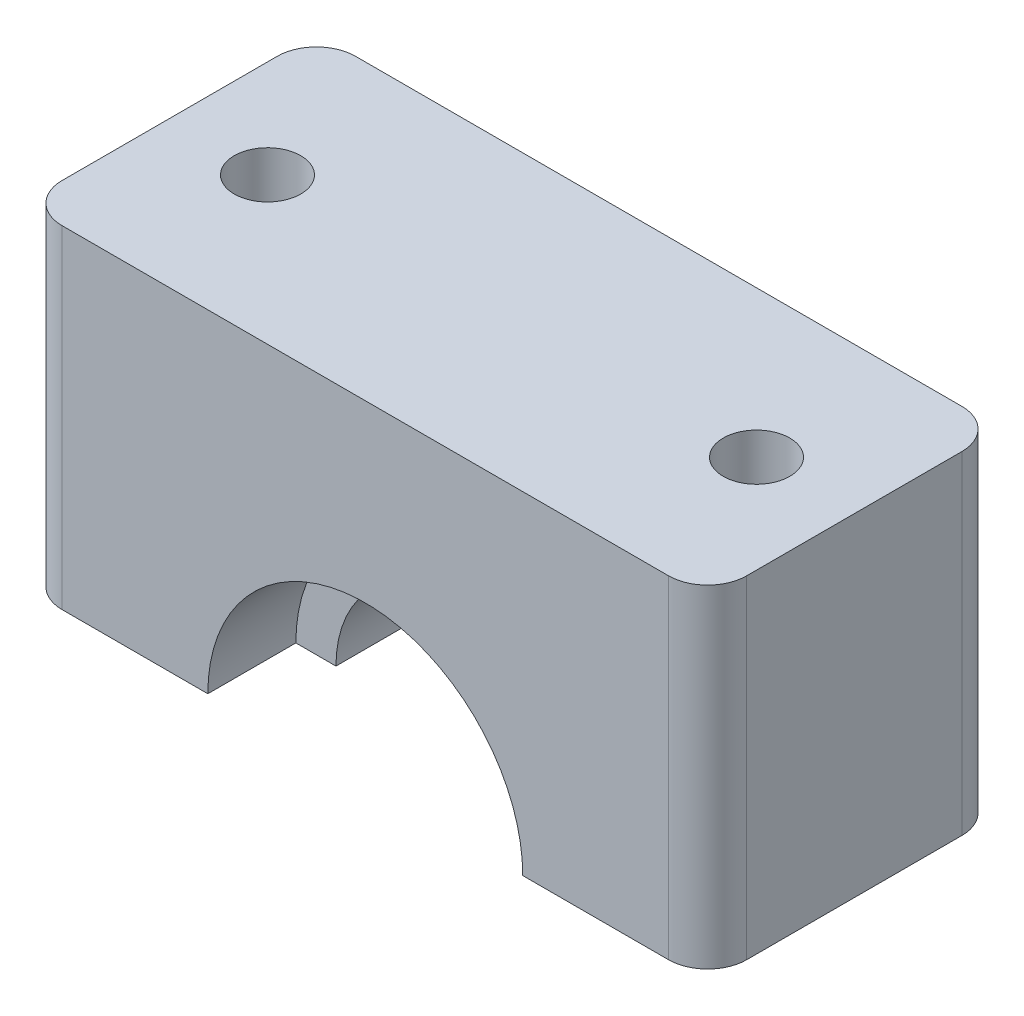
ISO-10303-21;
HEADER;
FILE_DESCRIPTION(('STEP AP214'),'2;1');
FILE_NAME('part.step','',(''),(''),'','','');
FILE_SCHEMA(('AUTOMOTIVE_DESIGN { 1 0 10303 214 1 1 1 1 }'));
ENDSEC;
DATA;
#1=APPLICATION_CONTEXT('core data for automotive mechanical design processes');
#2=APPLICATION_PROTOCOL_DEFINITION('international standard','automotive_design',2000,#1);
#3=PRODUCT_CONTEXT('',#1,'mechanical');
#4=PRODUCT('Part','Part','',(#3));
#5=PRODUCT_RELATED_PRODUCT_CATEGORY('part','',(#4));
#6=PRODUCT_DEFINITION_FORMATION('','',#4);
#7=PRODUCT_DEFINITION_CONTEXT('part definition',#1,'design');
#8=PRODUCT_DEFINITION('design','',#6,#7);
#9=PRODUCT_DEFINITION_SHAPE('','',#8);
#10=(LENGTH_UNIT() NAMED_UNIT(*) SI_UNIT(.MILLI.,.METRE.));
#11=(NAMED_UNIT(*) PLANE_ANGLE_UNIT() SI_UNIT($,.RADIAN.));
#12=(NAMED_UNIT(*) SI_UNIT($,.STERADIAN.) SOLID_ANGLE_UNIT());
#13=UNCERTAINTY_MEASURE_WITH_UNIT(LENGTH_MEASURE(1.E-05),#10,'distance_accuracy_value','');
#14=(GEOMETRIC_REPRESENTATION_CONTEXT(3) GLOBAL_UNCERTAINTY_ASSIGNED_CONTEXT((#13)) GLOBAL_UNIT_ASSIGNED_CONTEXT((#10,
#11,#12)) REPRESENTATION_CONTEXT('',''));
#15=CARTESIAN_POINT('',(0.,0.,0.));
#16=DIRECTION('',(0.,0.,1.));
#17=DIRECTION('',(1.,0.,0.));
#18=AXIS2_PLACEMENT_3D('',#15,#16,#17);
#19=CARTESIAN_POINT('',(-10.5,-111.5,171.));
#20=DIRECTION('',(0.,-1.,0.));
#21=DIRECTION('',(1.,0.,0.));
#22=AXIS2_PLACEMENT_3D('',#19,#20,#21);
#23=PLANE('',#22);
#24=CARTESIAN_POINT('',(2.,-111.5,191.5));
#25=DIRECTION('',(0.,-1.,0.));
#26=DIRECTION('',(0.,0.,-1.));
#27=AXIS2_PLACEMENT_3D('',#24,#25,#26);
#28=CIRCLE('',#27,1.7);
#29=CARTESIAN_POINT('',(2.,-111.5,189.8));
#30=VERTEX_POINT('',#29);
#31=EDGE_CURVE('E221',#30,#30,#28,.T.);
#32=ORIENTED_EDGE('',*,*,#31,.F.);
#33=EDGE_LOOP('',(#32));
#34=FACE_BOUND('',#33,.T.);
#35=DIRECTION('',(0.,0.,-1.));
#36=VECTOR('',#35,1.);
#37=CARTESIAN_POINT('',(7.,-111.5,191.5));
#38=LINE('',#37,#36);
#39=CARTESIAN_POINT('',(7.,-111.5,197.));
#40=VERTEX_POINT('',#39);
#41=CARTESIAN_POINT('',(7.,-111.5,186.));
#42=VERTEX_POINT('',#41);
#43=EDGE_CURVE('E207',#40,#42,#38,.T.);
#44=ORIENTED_EDGE('',*,*,#43,.F.);
#45=CARTESIAN_POINT('',(5.,-111.5,197.));
#46=DIRECTION('',(0.,-1.,0.));
#47=DIRECTION('',(0.,0.,-1.));
#48=AXIS2_PLACEMENT_3D('',#45,#46,#47);
#49=CIRCLE('',#48,2.);
#50=CARTESIAN_POINT('',(5.,-111.5,199.));
#51=VERTEX_POINT('',#50);
#52=EDGE_CURVE('E253',#40,#51,#49,.T.);
#53=ORIENTED_EDGE('',*,*,#52,.T.);
#54=DIRECTION('',(-1.,0.,0.));
#55=VECTOR('',#54,1.);
#56=CARTESIAN_POINT('',(-10.5,-111.5,199.));
#57=LINE('',#56,#55);
#58=CARTESIAN_POINT('',(-2.45,-111.5,199.));
#59=VERTEX_POINT('',#58);
#60=EDGE_CURVE('E187',#51,#59,#57,.T.);
#61=ORIENTED_EDGE('',*,*,#60,.T.);
#62=DIRECTION('',(0.,0.,1.));
#63=VECTOR('',#62,1.);
#64=CARTESIAN_POINT('',(-2.45,-111.5,194.5));
#65=LINE('',#64,#63);
#66=CARTESIAN_POINT('',(-2.45,-111.5,194.5));
#67=VERTEX_POINT('',#66);
#68=EDGE_CURVE('E196',#67,#59,#65,.T.);
#69=ORIENTED_EDGE('',*,*,#68,.F.);
#70=DIRECTION('',(-1.,0.,0.));
#71=VECTOR('',#70,1.);
#72=CARTESIAN_POINT('',(-10.5,-111.5,194.5));
#73=LINE('',#72,#71);
#74=CARTESIAN_POINT('',(-4.5,-111.5,194.5));
#75=VERTEX_POINT('',#74);
#76=EDGE_CURVE('E306',#67,#75,#73,.T.);
#77=ORIENTED_EDGE('',*,*,#76,.T.);
#78=DIRECTION('',(0.,0.,1.));
#79=VECTOR('',#78,1.);
#80=CARTESIAN_POINT('',(-4.5,-111.5,174.));
#81=LINE('',#80,#79);
#82=CARTESIAN_POINT('',(-4.5,-111.5,189.5));
#83=VERTEX_POINT('',#82);
#84=EDGE_CURVE('E211',#83,#75,#81,.T.);
#85=ORIENTED_EDGE('',*,*,#84,.F.);
#86=DIRECTION('',(1.,0.,0.));
#87=VECTOR('',#86,1.);
#88=CARTESIAN_POINT('',(-10.5,-111.5,189.5));
#89=LINE('',#88,#87);
#90=CARTESIAN_POINT('',(-2.45,-111.5,189.5));
#91=VERTEX_POINT('',#90);
#92=EDGE_CURVE('E325',#83,#91,#89,.T.);
#93=ORIENTED_EDGE('',*,*,#92,.T.);
#94=DIRECTION('',(0.,0.,-1.));
#95=VECTOR('',#94,1.);
#96=CARTESIAN_POINT('',(-2.45,-111.5,189.5));
#97=LINE('',#96,#95);
#98=CARTESIAN_POINT('',(-2.45,-111.5,184.));
#99=VERTEX_POINT('',#98);
#100=EDGE_CURVE('E276',#91,#99,#97,.T.);
#101=ORIENTED_EDGE('',*,*,#100,.T.);
#102=DIRECTION('',(-1.,0.,0.));
#103=VECTOR('',#102,1.);
#104=CARTESIAN_POINT('',(-10.5,-111.5,184.));
#105=LINE('',#104,#103);
#106=CARTESIAN_POINT('',(5.,-111.5,184.));
#107=VERTEX_POINT('',#106);
#108=EDGE_CURVE('E172',#107,#99,#105,.T.);
#109=ORIENTED_EDGE('',*,*,#108,.F.);
#110=CARTESIAN_POINT('',(5.,-111.5,186.));
#111=DIRECTION('',(0.,-1.,0.));
#112=DIRECTION('',(0.,0.,-1.));
#113=AXIS2_PLACEMENT_3D('',#110,#111,#112);
#114=CIRCLE('',#113,2.);
#115=EDGE_CURVE('E250',#107,#42,#114,.T.);
#116=ORIENTED_EDGE('',*,*,#115,.T.);
#117=EDGE_LOOP('',(#44,#53,#61,#69,#77,#85,#93,#101,#109,#116));
#118=FACE_BOUND('',#117,.T.);
#119=ADVANCED_FACE('F16',(#34,#118),#23,.T.);
#120=CARTESIAN_POINT('',(-23.,-111.5,191.5));
#121=DIRECTION('',(0.,-1.,0.));
#122=DIRECTION('',(0.,0.,-1.));
#123=AXIS2_PLACEMENT_3D('',#120,#121,#122);
#124=CIRCLE('',#123,1.7);
#125=CARTESIAN_POINT('',(-23.,-111.5,189.8));
#126=VERTEX_POINT('',#125);
#127=EDGE_CURVE('E174',#126,#126,#124,.T.);
#128=ORIENTED_EDGE('',*,*,#127,.F.);
#129=EDGE_LOOP('',(#128));
#130=FACE_BOUND('',#129,.T.);
#131=CARTESIAN_POINT('',(-18.55,-111.5,199.));
#132=VERTEX_POINT('',#131);
#133=CARTESIAN_POINT('',(-26.,-111.5,199.));
#134=VERTEX_POINT('',#133);
#135=EDGE_CURVE('E299',#132,#134,#57,.T.);
#136=ORIENTED_EDGE('',*,*,#135,.T.);
#137=CARTESIAN_POINT('',(-26.,-111.5,197.));
#138=DIRECTION('',(0.,-1.,0.));
#139=DIRECTION('',(0.,0.,-1.));
#140=AXIS2_PLACEMENT_3D('',#137,#138,#139);
#141=CIRCLE('',#140,2.);
#142=CARTESIAN_POINT('',(-28.,-111.5,197.));
#143=VERTEX_POINT('',#142);
#144=EDGE_CURVE('E264',#134,#143,#141,.T.);
#145=ORIENTED_EDGE('',*,*,#144,.T.);
#146=DIRECTION('',(0.,0.,-1.));
#147=VECTOR('',#146,1.);
#148=CARTESIAN_POINT('',(-28.,-111.5,191.5));
#149=LINE('',#148,#147);
#150=CARTESIAN_POINT('',(-28.,-111.5,186.));
#151=VERTEX_POINT('',#150);
#152=EDGE_CURVE('E179',#143,#151,#149,.T.);
#153=ORIENTED_EDGE('',*,*,#152,.T.);
#154=CARTESIAN_POINT('',(-26.,-111.5,186.));
#155=DIRECTION('',(0.,-1.,0.));
#156=DIRECTION('',(0.,0.,-1.));
#157=AXIS2_PLACEMENT_3D('',#154,#155,#156);
#158=CIRCLE('',#157,2.);
#159=CARTESIAN_POINT('',(-26.,-111.5,184.));
#160=VERTEX_POINT('',#159);
#161=EDGE_CURVE('E37',#151,#160,#158,.T.);
#162=ORIENTED_EDGE('',*,*,#161,.T.);
#163=CARTESIAN_POINT('',(-18.55,-111.5,184.));
#164=VERTEX_POINT('',#163);
#165=EDGE_CURVE('E169',#164,#160,#105,.T.);
#166=ORIENTED_EDGE('',*,*,#165,.F.);
#167=DIRECTION('',(0.,0.,-1.));
#168=VECTOR('',#167,1.);
#169=CARTESIAN_POINT('',(-18.55,-111.5,189.5));
#170=LINE('',#169,#168);
#171=CARTESIAN_POINT('',(-18.55,-111.5,189.5));
#172=VERTEX_POINT('',#171);
#173=EDGE_CURVE('E155',#164,#172,#170,.F.);
#174=ORIENTED_EDGE('',*,*,#173,.T.);
#175=DIRECTION('',(1.,0.,0.));
#176=VECTOR('',#175,1.);
#177=CARTESIAN_POINT('',(-10.5,-111.5,189.5));
#178=LINE('',#177,#176);
#179=CARTESIAN_POINT('',(-16.5,-111.5,189.5));
#180=VERTEX_POINT('',#179);
#181=EDGE_CURVE('E328',#172,#180,#178,.T.);
#182=ORIENTED_EDGE('',*,*,#181,.T.);
#183=DIRECTION('',(0.,0.,1.));
#184=VECTOR('',#183,1.);
#185=CARTESIAN_POINT('',(-16.5,-111.5,174.));
#186=LINE('',#185,#184);
#187=CARTESIAN_POINT('',(-16.5,-111.5,194.5));
#188=VERTEX_POINT('',#187);
#189=EDGE_CURVE('E185',#188,#180,#186,.F.);
#190=ORIENTED_EDGE('',*,*,#189,.F.);
#191=DIRECTION('',(-1.,0.,0.));
#192=VECTOR('',#191,1.);
#193=CARTESIAN_POINT('',(-10.5,-111.5,194.5));
#194=LINE('',#193,#192);
#195=CARTESIAN_POINT('',(-18.55,-111.5,194.5));
#196=VERTEX_POINT('',#195);
#197=EDGE_CURVE('E310',#188,#196,#194,.T.);
#198=ORIENTED_EDGE('',*,*,#197,.T.);
#199=DIRECTION('',(0.,0.,1.));
#200=VECTOR('',#199,1.);
#201=CARTESIAN_POINT('',(-18.55,-111.5,194.5));
#202=LINE('',#201,#200);
#203=EDGE_CURVE('E165',#132,#196,#202,.F.);
#204=ORIENTED_EDGE('',*,*,#203,.F.);
#205=EDGE_LOOP('',(#136,#145,#153,#162,#166,#174,#182,#190,#198,#204));
#206=FACE_BOUND('',#205,.T.);
#207=ADVANCED_FACE('F177',(#130,#206),#23,.T.);
#208=CARTESIAN_POINT('',(-10.5,-111.5,174.));
#209=DIRECTION('',(0.,0.,1.));
#210=DIRECTION('',(1.,0.,0.));
#211=AXIS2_PLACEMENT_3D('',#208,#209,#210);
#212=CYLINDRICAL_SURFACE('',#211,6.);
#213=CARTESIAN_POINT('',(-10.5,-111.5,189.5));
#214=DIRECTION('',(0.,0.,1.));
#215=DIRECTION('',(-1.,0.,0.));
#216=AXIS2_PLACEMENT_3D('',#213,#214,#215);
#217=CIRCLE('',#216,6.);
#218=EDGE_CURVE('E330',#83,#180,#217,.T.);
#219=ORIENTED_EDGE('',*,*,#218,.F.);
#220=ORIENTED_EDGE('',*,*,#84,.T.);
#221=CARTESIAN_POINT('',(-10.5,-111.5,194.5));
#222=DIRECTION('',(0.,0.,1.));
#223=DIRECTION('',(1.,0.,0.));
#224=AXIS2_PLACEMENT_3D('',#221,#222,#223);
#225=CIRCLE('',#224,6.);
#226=EDGE_CURVE('E314',#75,#188,#225,.T.);
#227=ORIENTED_EDGE('',*,*,#226,.T.);
#228=ORIENTED_EDGE('',*,*,#189,.T.);
#229=EDGE_LOOP('',(#219,#220,#227,#228));
#230=FACE_BOUND('',#229,.T.);
#231=ADVANCED_FACE('F353',(#230),#212,.F.);
#232=CARTESIAN_POINT('',(-10.5,-111.5,199.));
#233=DIRECTION('',(0.,0.,-1.));
#234=DIRECTION('',(-1.,0.,0.));
#235=AXIS2_PLACEMENT_3D('',#232,#233,#234);
#236=PLANE('',#235);
#237=ORIENTED_EDGE('',*,*,#60,.F.);
#238=DIRECTION('',(0.,1.,0.));
#239=VECTOR('',#238,1.);
#240=CARTESIAN_POINT('',(5.,-94.5,199.));
#241=LINE('',#240,#239);
#242=CARTESIAN_POINT('',(5.,-94.5,199.));
#243=VERTEX_POINT('',#242);
#244=EDGE_CURVE('E228',#51,#243,#241,.T.);
#245=ORIENTED_EDGE('',*,*,#244,.T.);
#246=DIRECTION('',(-1.,0.,0.));
#247=VECTOR('',#246,1.);
#248=CARTESIAN_POINT('',(-10.5,-94.5,199.));
#249=LINE('',#248,#247);
#250=CARTESIAN_POINT('',(-26.,-94.5,199.));
#251=VERTEX_POINT('',#250);
#252=EDGE_CURVE('E195',#243,#251,#249,.T.);
#253=ORIENTED_EDGE('',*,*,#252,.T.);
#254=DIRECTION('',(0.,1.,0.));
#255=VECTOR('',#254,1.);
#256=CARTESIAN_POINT('',(-26.,-111.5,199.));
#257=LINE('',#256,#255);
#258=EDGE_CURVE('E164',#251,#134,#257,.F.);
#259=ORIENTED_EDGE('',*,*,#258,.T.);
#260=ORIENTED_EDGE('',*,*,#135,.F.);
#261=CARTESIAN_POINT('',(-10.5,-111.5,199.));
#262=DIRECTION('',(0.,0.,1.));
#263=DIRECTION('',(1.,0.,0.));
#264=AXIS2_PLACEMENT_3D('',#261,#262,#263);
#265=CIRCLE('',#264,8.05);
#266=EDGE_CURVE('E295',#59,#132,#265,.T.);
#267=ORIENTED_EDGE('',*,*,#266,.F.);
#268=EDGE_LOOP('',(#237,#245,#253,#259,#260,#267));
#269=FACE_BOUND('',#268,.T.);
#270=ADVANCED_FACE('F291',(#269),#236,.F.);
#271=CARTESIAN_POINT('',(7.,-111.5,191.5));
#272=DIRECTION('',(1.,0.,0.));
#273=DIRECTION('',(0.,0.,-1.));
#274=AXIS2_PLACEMENT_3D('',#271,#272,#273);
#275=PLANE('',#274);
#276=DIRECTION('',(0.,0.,-1.));
#277=VECTOR('',#276,1.);
#278=CARTESIAN_POINT('',(7.,-94.5,191.5));
#279=LINE('',#278,#277);
#280=CARTESIAN_POINT('',(7.,-94.5,197.));
#281=VERTEX_POINT('',#280);
#282=CARTESIAN_POINT('',(7.,-94.5,186.));
#283=VERTEX_POINT('',#282);
#284=EDGE_CURVE('E191',#281,#283,#279,.T.);
#285=ORIENTED_EDGE('',*,*,#284,.F.);
#286=DIRECTION('',(0.,1.,0.));
#287=VECTOR('',#286,1.);
#288=CARTESIAN_POINT('',(7.,-111.5,197.));
#289=LINE('',#288,#287);
#290=EDGE_CURVE('E248',#281,#40,#289,.F.);
#291=ORIENTED_EDGE('',*,*,#290,.T.);
#292=ORIENTED_EDGE('',*,*,#43,.T.);
#293=DIRECTION('',(0.,1.,0.));
#294=VECTOR('',#293,1.);
#295=CARTESIAN_POINT('',(7.,-111.5,186.));
#296=LINE('',#295,#294);
#297=EDGE_CURVE('E244',#42,#283,#296,.T.);
#298=ORIENTED_EDGE('',*,*,#297,.T.);
#299=EDGE_LOOP('',(#285,#291,#292,#298));
#300=FACE_BOUND('',#299,.T.);
#301=ADVANCED_FACE('F280',(#300),#275,.T.);
#302=CARTESIAN_POINT('',(-28.,-111.5,191.5));
#303=DIRECTION('',(1.,0.,0.));
#304=DIRECTION('',(0.,0.,-1.));
#305=AXIS2_PLACEMENT_3D('',#302,#303,#304);
#306=PLANE('',#305);
#307=ORIENTED_EDGE('',*,*,#152,.F.);
#308=DIRECTION('',(0.,1.,0.));
#309=VECTOR('',#308,1.);
#310=CARTESIAN_POINT('',(-28.,-111.5,197.));
#311=LINE('',#310,#309);
#312=CARTESIAN_POINT('',(-28.,-94.5,197.));
#313=VERTEX_POINT('',#312);
#314=EDGE_CURVE('E258',#143,#313,#311,.T.);
#315=ORIENTED_EDGE('',*,*,#314,.T.);
#316=DIRECTION('',(0.,0.,-1.));
#317=VECTOR('',#316,1.);
#318=CARTESIAN_POINT('',(-28.,-94.5,191.5));
#319=LINE('',#318,#317);
#320=CARTESIAN_POINT('',(-28.,-94.5,186.));
#321=VERTEX_POINT('',#320);
#322=EDGE_CURVE('E200',#313,#321,#319,.T.);
#323=ORIENTED_EDGE('',*,*,#322,.T.);
#324=DIRECTION('',(0.,1.,0.));
#325=VECTOR('',#324,1.);
#326=CARTESIAN_POINT('',(-28.,-111.5,186.));
#327=LINE('',#326,#325);
#328=EDGE_CURVE('E48',#321,#151,#327,.F.);
#329=ORIENTED_EDGE('',*,*,#328,.T.);
#330=EDGE_LOOP('',(#307,#315,#323,#329));
#331=FACE_BOUND('',#330,.T.);
#332=ADVANCED_FACE('F364',(#331),#306,.F.);
#333=CARTESIAN_POINT('',(-10.5,-111.5,184.));
#334=DIRECTION('',(0.,0.,-1.));
#335=DIRECTION('',(-1.,0.,0.));
#336=AXIS2_PLACEMENT_3D('',#333,#334,#335);
#337=PLANE('',#336);
#338=ORIENTED_EDGE('',*,*,#165,.T.);
#339=DIRECTION('',(0.,1.,0.));
#340=VECTOR('',#339,1.);
#341=CARTESIAN_POINT('',(-26.,-94.5,184.));
#342=LINE('',#341,#340);
#343=CARTESIAN_POINT('',(-26.,-94.5,184.));
#344=VERTEX_POINT('',#343);
#345=EDGE_CURVE('E10',#160,#344,#342,.T.);
#346=ORIENTED_EDGE('',*,*,#345,.T.);
#347=DIRECTION('',(-1.,0.,0.));
#348=VECTOR('',#347,1.);
#349=CARTESIAN_POINT('',(-10.5,-94.5,184.));
#350=LINE('',#349,#348);
#351=CARTESIAN_POINT('',(5.,-94.5,184.));
#352=VERTEX_POINT('',#351);
#353=EDGE_CURVE('E203',#352,#344,#350,.T.);
#354=ORIENTED_EDGE('',*,*,#353,.F.);
#355=DIRECTION('',(0.,1.,0.));
#356=VECTOR('',#355,1.);
#357=CARTESIAN_POINT('',(5.,-111.5,184.));
#358=LINE('',#357,#356);
#359=EDGE_CURVE('E25',#352,#107,#358,.F.);
#360=ORIENTED_EDGE('',*,*,#359,.T.);
#361=ORIENTED_EDGE('',*,*,#108,.T.);
#362=CARTESIAN_POINT('',(-10.5,-111.5,184.));
#363=DIRECTION('',(0.,0.,1.));
#364=DIRECTION('',(-1.,0.,0.));
#365=AXIS2_PLACEMENT_3D('',#362,#363,#364);
#366=CIRCLE('',#365,8.05);
#367=EDGE_CURVE('E158',#99,#164,#366,.T.);
#368=ORIENTED_EDGE('',*,*,#367,.T.);
#369=EDGE_LOOP('',(#338,#346,#354,#360,#361,#368));
#370=FACE_BOUND('',#369,.T.);
#371=ADVANCED_FACE('F168',(#370),#337,.T.);
#372=CARTESIAN_POINT('',(-10.5,-94.5,171.));
#373=DIRECTION('',(0.,-1.,0.));
#374=DIRECTION('',(1.,0.,0.));
#375=AXIS2_PLACEMENT_3D('',#372,#373,#374);
#376=PLANE('',#375);
#377=CARTESIAN_POINT('',(-23.,-94.5,191.5));
#378=DIRECTION('',(0.,-1.,0.));
#379=DIRECTION('',(0.,0.,-1.));
#380=AXIS2_PLACEMENT_3D('',#377,#378,#379);
#381=CIRCLE('',#380,1.7);
#382=CARTESIAN_POINT('',(-23.,-94.5,189.8));
#383=VERTEX_POINT('',#382);
#384=EDGE_CURVE('E222',#383,#383,#381,.T.);
#385=ORIENTED_EDGE('',*,*,#384,.T.);
#386=EDGE_LOOP('',(#385));
#387=FACE_BOUND('',#386,.T.);
#388=CARTESIAN_POINT('',(2.,-94.5,191.5));
#389=DIRECTION('',(0.,-1.,0.));
#390=DIRECTION('',(0.,0.,-1.));
#391=AXIS2_PLACEMENT_3D('',#388,#389,#390);
#392=CIRCLE('',#391,1.7);
#393=CARTESIAN_POINT('',(2.,-94.5,189.8));
#394=VERTEX_POINT('',#393);
#395=EDGE_CURVE('E217',#394,#394,#392,.T.);
#396=ORIENTED_EDGE('',*,*,#395,.T.);
#397=EDGE_LOOP('',(#396));
#398=FACE_BOUND('',#397,.T.);
#399=ORIENTED_EDGE('',*,*,#252,.F.);
#400=CARTESIAN_POINT('',(5.,-94.5,197.));
#401=DIRECTION('',(0.,-1.,0.));
#402=DIRECTION('',(0.,0.,-1.));
#403=AXIS2_PLACEMENT_3D('',#400,#401,#402);
#404=CIRCLE('',#403,2.);
#405=EDGE_CURVE('E241',#243,#281,#404,.F.);
#406=ORIENTED_EDGE('',*,*,#405,.T.);
#407=ORIENTED_EDGE('',*,*,#284,.T.);
#408=CARTESIAN_POINT('',(5.,-94.5,186.));
#409=DIRECTION('',(0.,-1.,0.));
#410=DIRECTION('',(0.,0.,-1.));
#411=AXIS2_PLACEMENT_3D('',#408,#409,#410);
#412=CIRCLE('',#411,2.);
#413=EDGE_CURVE('E232',#283,#352,#412,.F.);
#414=ORIENTED_EDGE('',*,*,#413,.T.);
#415=ORIENTED_EDGE('',*,*,#353,.T.);
#416=CARTESIAN_POINT('',(-26.,-94.5,186.));
#417=DIRECTION('',(0.,-1.,0.));
#418=DIRECTION('',(0.,0.,-1.));
#419=AXIS2_PLACEMENT_3D('',#416,#417,#418);
#420=CIRCLE('',#419,2.);
#421=EDGE_CURVE('E235',#344,#321,#420,.F.);
#422=ORIENTED_EDGE('',*,*,#421,.T.);
#423=ORIENTED_EDGE('',*,*,#322,.F.);
#424=CARTESIAN_POINT('',(-26.,-94.5,197.));
#425=DIRECTION('',(0.,-1.,0.));
#426=DIRECTION('',(0.,0.,-1.));
#427=AXIS2_PLACEMENT_3D('',#424,#425,#426);
#428=CIRCLE('',#427,2.);
#429=EDGE_CURVE('E238',#313,#251,#428,.F.);
#430=ORIENTED_EDGE('',*,*,#429,.T.);
#431=EDGE_LOOP('',(#399,#406,#407,#414,#415,#422,#423,#430));
#432=FACE_BOUND('',#431,.T.);
#433=ADVANCED_FACE('F284',(#387,#398,#432),#376,.F.);
#434=CARTESIAN_POINT('',(-10.5,-111.5,194.5));
#435=DIRECTION('',(0.,0.,1.));
#436=DIRECTION('',(1.,0.,0.));
#437=AXIS2_PLACEMENT_3D('',#434,#435,#436);
#438=CYLINDRICAL_SURFACE('',#437,8.05);
#439=ORIENTED_EDGE('',*,*,#68,.T.);
#440=ORIENTED_EDGE('',*,*,#266,.T.);
#441=ORIENTED_EDGE('',*,*,#203,.T.);
#442=CARTESIAN_POINT('',(-10.5,-111.5,194.5));
#443=DIRECTION('',(0.,0.,1.));
#444=DIRECTION('',(1.,0.,0.));
#445=AXIS2_PLACEMENT_3D('',#442,#443,#444);
#446=CIRCLE('',#445,8.05);
#447=EDGE_CURVE('E317',#67,#196,#446,.T.);
#448=ORIENTED_EDGE('',*,*,#447,.F.);
#449=EDGE_LOOP('',(#439,#440,#441,#448));
#450=FACE_BOUND('',#449,.T.);
#451=ADVANCED_FACE('F360',(#450),#438,.F.);
#452=CARTESIAN_POINT('',(-10.5,-107.025,194.5));
#453=DIRECTION('',(0.,0.,1.));
#454=DIRECTION('',(1.,0.,0.));
#455=AXIS2_PLACEMENT_3D('',#452,#453,#454);
#456=PLANE('',#455);
#457=ORIENTED_EDGE('',*,*,#447,.T.);
#458=ORIENTED_EDGE('',*,*,#197,.F.);
#459=ORIENTED_EDGE('',*,*,#226,.F.);
#460=ORIENTED_EDGE('',*,*,#76,.F.);
#461=EDGE_LOOP('',(#457,#458,#459,#460));
#462=FACE_BOUND('',#461,.T.);
#463=ADVANCED_FACE('F393',(#462),#456,.T.);
#464=CARTESIAN_POINT('',(-10.5,-111.5,189.5));
#465=DIRECTION('',(0.,0.,-1.));
#466=DIRECTION('',(-1.,0.,0.));
#467=AXIS2_PLACEMENT_3D('',#464,#465,#466);
#468=CYLINDRICAL_SURFACE('',#467,8.05);
#469=CARTESIAN_POINT('',(-10.5,-111.5,189.5));
#470=DIRECTION('',(0.,0.,1.));
#471=DIRECTION('',(-1.,0.,0.));
#472=AXIS2_PLACEMENT_3D('',#469,#470,#471);
#473=CIRCLE('',#472,8.05);
#474=EDGE_CURVE('E161',#91,#172,#473,.T.);
#475=ORIENTED_EDGE('',*,*,#474,.T.);
#476=ORIENTED_EDGE('',*,*,#173,.F.);
#477=ORIENTED_EDGE('',*,*,#367,.F.);
#478=ORIENTED_EDGE('',*,*,#100,.F.);
#479=EDGE_LOOP('',(#475,#476,#477,#478));
#480=FACE_BOUND('',#479,.T.);
#481=ADVANCED_FACE('F157',(#480),#468,.F.);
#482=CARTESIAN_POINT('',(-10.5,-114.975,189.5));
#483=DIRECTION('',(0.,0.,-1.));
#484=DIRECTION('',(1.,0.,0.));
#485=AXIS2_PLACEMENT_3D('',#482,#483,#484);
#486=PLANE('',#485);
#487=ORIENTED_EDGE('',*,*,#218,.T.);
#488=ORIENTED_EDGE('',*,*,#181,.F.);
#489=ORIENTED_EDGE('',*,*,#474,.F.);
#490=ORIENTED_EDGE('',*,*,#92,.F.);
#491=EDGE_LOOP('',(#487,#488,#489,#490));
#492=FACE_BOUND('',#491,.T.);
#493=ADVANCED_FACE('F397',(#492),#486,.T.);
#494=CARTESIAN_POINT('',(2.,-89.498,191.5));
#495=DIRECTION('',(0.,-1.,0.));
#496=DIRECTION('',(0.,0.,-1.));
#497=AXIS2_PLACEMENT_3D('',#494,#495,#496);
#498=CYLINDRICAL_SURFACE('',#497,1.7);
#499=ORIENTED_EDGE('',*,*,#31,.T.);
#500=EDGE_LOOP('',(#499));
#501=FACE_BOUND('',#500,.T.);
#502=ORIENTED_EDGE('',*,*,#395,.F.);
#503=EDGE_LOOP('',(#502));
#504=FACE_BOUND('',#503,.T.);
#505=ADVANCED_FACE('F344',(#501,#504),#498,.F.);
#506=CARTESIAN_POINT('',(-23.,-89.498,191.5));
#507=DIRECTION('',(0.,-1.,0.));
#508=DIRECTION('',(0.,0.,-1.));
#509=AXIS2_PLACEMENT_3D('',#506,#507,#508);
#510=CYLINDRICAL_SURFACE('',#509,1.7);
#511=ORIENTED_EDGE('',*,*,#127,.T.);
#512=EDGE_LOOP('',(#511));
#513=FACE_BOUND('',#512,.T.);
#514=ORIENTED_EDGE('',*,*,#384,.F.);
#515=EDGE_LOOP('',(#514));
#516=FACE_BOUND('',#515,.T.);
#517=ADVANCED_FACE('F374',(#513,#516),#510,.F.);
#518=CARTESIAN_POINT('',(5.,-111.5,197.));
#519=DIRECTION('',(0.,-1.,0.));
#520=DIRECTION('',(0.,0.,-1.));
#521=AXIS2_PLACEMENT_3D('',#518,#519,#520);
#522=CYLINDRICAL_SURFACE('',#521,2.);
#523=ORIENTED_EDGE('',*,*,#52,.F.);
#524=ORIENTED_EDGE('',*,*,#290,.F.);
#525=ORIENTED_EDGE('',*,*,#405,.F.);
#526=ORIENTED_EDGE('',*,*,#244,.F.);
#527=EDGE_LOOP('',(#523,#524,#525,#526));
#528=FACE_BOUND('',#527,.T.);
#529=ADVANCED_FACE('F288',(#528),#522,.T.);
#530=CARTESIAN_POINT('',(-26.,-111.5,197.));
#531=DIRECTION('',(0.,1.,0.));
#532=DIRECTION('',(0.,0.,1.));
#533=AXIS2_PLACEMENT_3D('',#530,#531,#532);
#534=CYLINDRICAL_SURFACE('',#533,2.);
#535=ORIENTED_EDGE('',*,*,#144,.F.);
#536=ORIENTED_EDGE('',*,*,#258,.F.);
#537=ORIENTED_EDGE('',*,*,#429,.F.);
#538=ORIENTED_EDGE('',*,*,#314,.F.);
#539=EDGE_LOOP('',(#535,#536,#537,#538));
#540=FACE_BOUND('',#539,.T.);
#541=ADVANCED_FACE('F373',(#540),#534,.T.);
#542=CARTESIAN_POINT('',(-26.,-111.5,186.));
#543=DIRECTION('',(0.,-1.,0.));
#544=DIRECTION('',(0.,0.,-1.));
#545=AXIS2_PLACEMENT_3D('',#542,#543,#544);
#546=CYLINDRICAL_SURFACE('',#545,2.);
#547=ORIENTED_EDGE('',*,*,#161,.F.);
#548=ORIENTED_EDGE('',*,*,#328,.F.);
#549=ORIENTED_EDGE('',*,*,#421,.F.);
#550=ORIENTED_EDGE('',*,*,#345,.F.);
#551=EDGE_LOOP('',(#547,#548,#549,#550));
#552=FACE_BOUND('',#551,.T.);
#553=ADVANCED_FACE('F376',(#552),#546,.T.);
#554=CARTESIAN_POINT('',(5.,-111.5,186.));
#555=DIRECTION('',(0.,1.,0.));
#556=DIRECTION('',(0.,0.,1.));
#557=AXIS2_PLACEMENT_3D('',#554,#555,#556);
#558=CYLINDRICAL_SURFACE('',#557,2.);
#559=ORIENTED_EDGE('',*,*,#115,.F.);
#560=ORIENTED_EDGE('',*,*,#359,.F.);
#561=ORIENTED_EDGE('',*,*,#413,.F.);
#562=ORIENTED_EDGE('',*,*,#297,.F.);
#563=EDGE_LOOP('',(#559,#560,#561,#562));
#564=FACE_BOUND('',#563,.T.);
#565=ADVANCED_FACE('F18',(#564),#558,.T.);
#566=CLOSED_SHELL('',(#119,#207,#231,#270,#301,#332,#371,#433,#451,#463,#481,#493,#505,#517,
#529,#541,#553,#565));
#567=MANIFOLD_SOLID_BREP('B1',#566);
#568=ADVANCED_BREP_SHAPE_REPRESENTATION('',(#18,#567),#14);
#569=SHAPE_DEFINITION_REPRESENTATION(#9,#568);
ENDSEC;
END-ISO-10303-21;
